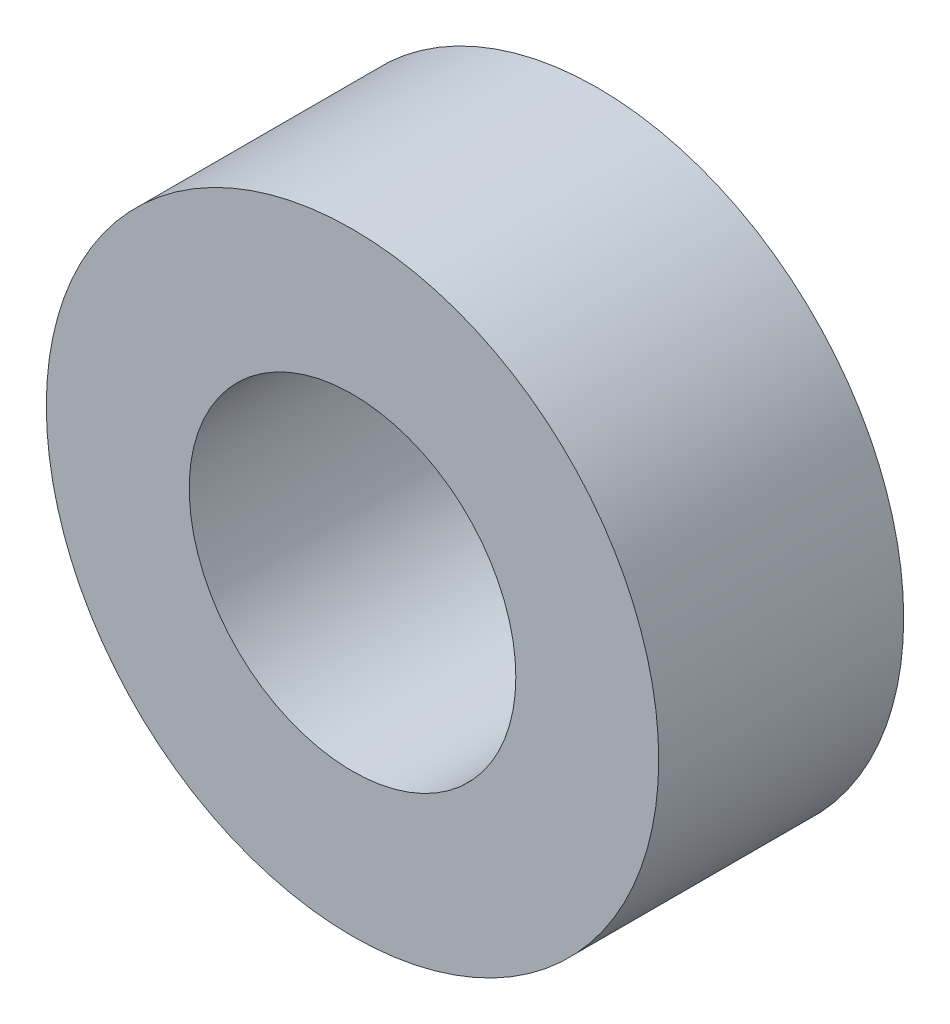
ISO-10303-21;
HEADER;
FILE_DESCRIPTION(('STEP AP214'),'2;1');
FILE_NAME('part.step','',(''),(''),'','','');
FILE_SCHEMA(('AUTOMOTIVE_DESIGN { 1 0 10303 214 1 1 1 1 }'));
ENDSEC;
DATA;
#1=APPLICATION_CONTEXT('core data for automotive mechanical design processes');
#2=APPLICATION_PROTOCOL_DEFINITION('international standard','automotive_design',2000,#1);
#3=PRODUCT_CONTEXT('',#1,'mechanical');
#4=PRODUCT('Part','Part','',(#3));
#5=PRODUCT_RELATED_PRODUCT_CATEGORY('part','',(#4));
#6=PRODUCT_DEFINITION_FORMATION('','',#4);
#7=PRODUCT_DEFINITION_CONTEXT('part definition',#1,'design');
#8=PRODUCT_DEFINITION('design','',#6,#7);
#9=PRODUCT_DEFINITION_SHAPE('','',#8);
#10=(LENGTH_UNIT() NAMED_UNIT(*) SI_UNIT(.MILLI.,.METRE.));
#11=(NAMED_UNIT(*) PLANE_ANGLE_UNIT() SI_UNIT($,.RADIAN.));
#12=(NAMED_UNIT(*) SI_UNIT($,.STERADIAN.) SOLID_ANGLE_UNIT());
#13=UNCERTAINTY_MEASURE_WITH_UNIT(LENGTH_MEASURE(1.E-05),#10,'distance_accuracy_value','');
#14=(GEOMETRIC_REPRESENTATION_CONTEXT(3) GLOBAL_UNCERTAINTY_ASSIGNED_CONTEXT((#13)) GLOBAL_UNIT_ASSIGNED_CONTEXT((#10,
#11,#12)) REPRESENTATION_CONTEXT('',''));
#15=CARTESIAN_POINT('',(0.,0.,0.));
#16=DIRECTION('',(0.,0.,1.));
#17=DIRECTION('',(1.,0.,0.));
#18=AXIS2_PLACEMENT_3D('',#15,#16,#17);
#19=CARTESIAN_POINT('',(0.,0.,2.4));
#20=DIRECTION('',(0.,0.,1.));
#21=DIRECTION('',(1.,0.,0.));
#22=AXIS2_PLACEMENT_3D('',#19,#20,#21);
#23=PLANE('',#22);
#24=CARTESIAN_POINT('',(0.,0.,2.4));
#25=DIRECTION('',(0.,0.,1.));
#26=DIRECTION('',(1.,0.,0.));
#27=AXIS2_PLACEMENT_3D('',#24,#25,#26);
#28=CIRCLE('',#27,3.);
#29=CARTESIAN_POINT('',(3.,0.,2.4));
#30=VERTEX_POINT('',#29);
#31=EDGE_CURVE('E10',#30,#30,#28,.T.);
#32=ORIENTED_EDGE('',*,*,#31,.T.);
#33=EDGE_LOOP('',(#32));
#34=FACE_BOUND('',#33,.T.);
#35=CARTESIAN_POINT('',(0.,0.,2.4));
#36=DIRECTION('',(0.,0.,1.));
#37=DIRECTION('',(1.,0.,0.));
#38=AXIS2_PLACEMENT_3D('',#35,#36,#37);
#39=CIRCLE('',#38,1.6);
#40=CARTESIAN_POINT('',(1.6,0.,2.4));
#41=VERTEX_POINT('',#40);
#42=EDGE_CURVE('E42',#41,#41,#39,.T.);
#43=ORIENTED_EDGE('',*,*,#42,.F.);
#44=EDGE_LOOP('',(#43));
#45=FACE_BOUND('',#44,.T.);
#46=ADVANCED_FACE('F31',(#34,#45),#23,.T.);
#47=CARTESIAN_POINT('',(0.,0.,0.));
#48=DIRECTION('',(0.,0.,1.));
#49=DIRECTION('',(1.,0.,0.));
#50=AXIS2_PLACEMENT_3D('',#47,#48,#49);
#51=PLANE('',#50);
#52=CARTESIAN_POINT('',(0.,0.,0.));
#53=DIRECTION('',(0.,0.,1.));
#54=DIRECTION('',(1.,0.,0.));
#55=AXIS2_PLACEMENT_3D('',#52,#53,#54);
#56=CIRCLE('',#55,3.);
#57=CARTESIAN_POINT('',(3.,0.,0.));
#58=VERTEX_POINT('',#57);
#59=EDGE_CURVE('E35',#58,#58,#56,.T.);
#60=ORIENTED_EDGE('',*,*,#59,.F.);
#61=EDGE_LOOP('',(#60));
#62=FACE_BOUND('',#61,.T.);
#63=CARTESIAN_POINT('',(0.,0.,0.));
#64=DIRECTION('',(0.,0.,1.));
#65=DIRECTION('',(1.,0.,0.));
#66=AXIS2_PLACEMENT_3D('',#63,#64,#65);
#67=CIRCLE('',#66,1.6);
#68=CARTESIAN_POINT('',(1.6,0.,0.));
#69=VERTEX_POINT('',#68);
#70=EDGE_CURVE('E44',#69,#69,#67,.T.);
#71=ORIENTED_EDGE('',*,*,#70,.T.);
#72=EDGE_LOOP('',(#71));
#73=FACE_BOUND('',#72,.T.);
#74=ADVANCED_FACE('F54',(#62,#73),#51,.F.);
#75=CARTESIAN_POINT('',(0.,0.,2.4));
#76=DIRECTION('',(0.,0.,-1.));
#77=DIRECTION('',(-1.,0.,0.));
#78=AXIS2_PLACEMENT_3D('',#75,#76,#77);
#79=CYLINDRICAL_SURFACE('',#78,3.);
#80=ORIENTED_EDGE('',*,*,#31,.F.);
#81=EDGE_LOOP('',(#80));
#82=FACE_BOUND('',#81,.T.);
#83=ORIENTED_EDGE('',*,*,#59,.T.);
#84=EDGE_LOOP('',(#83));
#85=FACE_BOUND('',#84,.T.);
#86=ADVANCED_FACE('F33',(#82,#85),#79,.T.);
#87=CARTESIAN_POINT('',(0.,0.,2.4));
#88=DIRECTION('',(0.,0.,-1.));
#89=DIRECTION('',(-1.,0.,0.));
#90=AXIS2_PLACEMENT_3D('',#87,#88,#89);
#91=CYLINDRICAL_SURFACE('',#90,1.6);
#92=ORIENTED_EDGE('',*,*,#42,.T.);
#93=EDGE_LOOP('',(#92));
#94=FACE_BOUND('',#93,.T.);
#95=ORIENTED_EDGE('',*,*,#70,.F.);
#96=EDGE_LOOP('',(#95));
#97=FACE_BOUND('',#96,.T.);
#98=ADVANCED_FACE('F50',(#94,#97),#91,.F.);
#99=CLOSED_SHELL('',(#46,#74,#86,#98));
#100=MANIFOLD_SOLID_BREP('B2',#99);
#101=ADVANCED_BREP_SHAPE_REPRESENTATION('',(#18,#100),#14);
#102=SHAPE_DEFINITION_REPRESENTATION(#9,#101);
ENDSEC;
END-ISO-10303-21;
